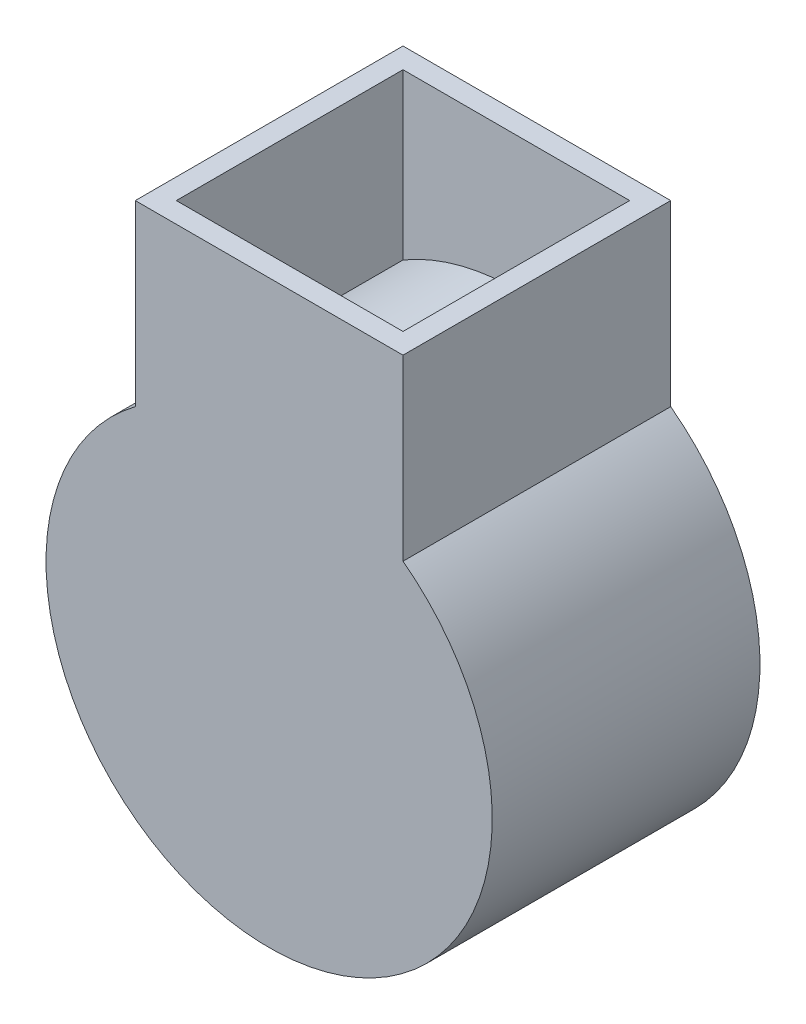
ISO-10303-21;
HEADER;
FILE_DESCRIPTION(('STEP AP214'),'2;1');
FILE_NAME('part.step','',(''),(''),'','','');
FILE_SCHEMA(('AUTOMOTIVE_DESIGN { 1 0 10303 214 1 1 1 1 }'));
ENDSEC;
DATA;
#1=APPLICATION_CONTEXT('core data for automotive mechanical design processes');
#2=APPLICATION_PROTOCOL_DEFINITION('international standard','automotive_design',2000,#1);
#3=PRODUCT_CONTEXT('',#1,'mechanical');
#4=PRODUCT('Part','Part','',(#3));
#5=PRODUCT_RELATED_PRODUCT_CATEGORY('part','',(#4));
#6=PRODUCT_DEFINITION_FORMATION('','',#4);
#7=PRODUCT_DEFINITION_CONTEXT('part definition',#1,'design');
#8=PRODUCT_DEFINITION('design','',#6,#7);
#9=PRODUCT_DEFINITION_SHAPE('','',#8);
#10=(LENGTH_UNIT() NAMED_UNIT(*) SI_UNIT(.MILLI.,.METRE.));
#11=(NAMED_UNIT(*) PLANE_ANGLE_UNIT() SI_UNIT($,.RADIAN.));
#12=(NAMED_UNIT(*) SI_UNIT($,.STERADIAN.) SOLID_ANGLE_UNIT());
#13=UNCERTAINTY_MEASURE_WITH_UNIT(LENGTH_MEASURE(1.E-05),#10,'distance_accuracy_value','');
#14=(GEOMETRIC_REPRESENTATION_CONTEXT(3) GLOBAL_UNCERTAINTY_ASSIGNED_CONTEXT((#13)) GLOBAL_UNIT_ASSIGNED_CONTEXT((#10,
#11,#12)) REPRESENTATION_CONTEXT('',''));
#15=CARTESIAN_POINT('',(0.,0.,0.));
#16=DIRECTION('',(0.,0.,1.));
#17=DIRECTION('',(1.,0.,0.));
#18=AXIS2_PLACEMENT_3D('',#15,#16,#17);
#19=CARTESIAN_POINT('',(0.,0.,30.));
#20=DIRECTION('',(0.,0.,-1.));
#21=DIRECTION('',(-1.,0.,0.));
#22=AXIS2_PLACEMENT_3D('',#19,#20,#21);
#23=CYLINDRICAL_SURFACE('',#22,50.);
#24=CARTESIAN_POINT('',(0.,0.,30.));
#25=DIRECTION('',(0.,0.,1.));
#26=DIRECTION('',(1.,0.,0.));
#27=AXIS2_PLACEMENT_3D('',#24,#25,#26);
#28=CIRCLE('',#27,50.);
#29=CARTESIAN_POINT('',(-30.,40.,30.));
#30=VERTEX_POINT('',#29);
#31=CARTESIAN_POINT('',(30.,40.,30.));
#32=VERTEX_POINT('',#31);
#33=EDGE_CURVE('E12',#30,#32,#28,.T.);
#34=ORIENTED_EDGE('',*,*,#33,.F.);
#35=DIRECTION('',(0.,0.,-1.));
#36=VECTOR('',#35,1.);
#37=CARTESIAN_POINT('',(-30.,40.,30.));
#38=LINE('',#37,#36);
#39=CARTESIAN_POINT('',(-30.,40.,-30.));
#40=VERTEX_POINT('',#39);
#41=EDGE_CURVE('E189',#40,#30,#38,.F.);
#42=ORIENTED_EDGE('',*,*,#41,.F.);
#43=CARTESIAN_POINT('',(0.,0.,-30.));
#44=DIRECTION('',(0.,0.,1.));
#45=DIRECTION('',(1.,0.,0.));
#46=AXIS2_PLACEMENT_3D('',#43,#44,#45);
#47=CIRCLE('',#46,50.);
#48=CARTESIAN_POINT('',(30.,40.,-30.));
#49=VERTEX_POINT('',#48);
#50=EDGE_CURVE('E62',#40,#49,#47,.T.);
#51=ORIENTED_EDGE('',*,*,#50,.T.);
#52=DIRECTION('',(0.,0.,-1.));
#53=VECTOR('',#52,1.);
#54=CARTESIAN_POINT('',(30.,40.,30.));
#55=LINE('',#54,#53);
#56=EDGE_CURVE('E125',#32,#49,#55,.T.);
#57=ORIENTED_EDGE('',*,*,#56,.F.);
#58=EDGE_LOOP('',(#34,#42,#51,#57));
#59=FACE_BOUND('',#58,.T.);
#60=ADVANCED_FACE('F59',(#59),#23,.T.);
#61=CARTESIAN_POINT('',(0.,0.,30.));
#62=DIRECTION('',(0.,0.,1.));
#63=DIRECTION('',(1.,0.,0.));
#64=AXIS2_PLACEMENT_3D('',#61,#62,#63);
#65=PLANE('',#64);
#66=ORIENTED_EDGE('',*,*,#33,.T.);
#67=DIRECTION('',(0.,1.,0.));
#68=VECTOR('',#67,1.);
#69=CARTESIAN_POINT('',(30.,-50.002,30.));
#70=LINE('',#69,#68);
#71=CARTESIAN_POINT('',(30.,80.,30.));
#72=VERTEX_POINT('',#71);
#73=EDGE_CURVE('E150',#32,#72,#70,.T.);
#74=ORIENTED_EDGE('',*,*,#73,.T.);
#75=DIRECTION('',(1.,0.,0.));
#76=VECTOR('',#75,1.);
#77=CARTESIAN_POINT('',(-30.,80.,30.));
#78=LINE('',#77,#76);
#79=CARTESIAN_POINT('',(-30.,80.,30.));
#80=VERTEX_POINT('',#79);
#81=EDGE_CURVE('E202',#80,#72,#78,.T.);
#82=ORIENTED_EDGE('',*,*,#81,.F.);
#83=DIRECTION('',(0.,1.,0.));
#84=VECTOR('',#83,1.);
#85=CARTESIAN_POINT('',(-30.,-50.002,30.));
#86=LINE('',#85,#84);
#87=EDGE_CURVE('E148',#30,#80,#86,.T.);
#88=ORIENTED_EDGE('',*,*,#87,.F.);
#89=EDGE_LOOP('',(#66,#74,#82,#88));
#90=FACE_BOUND('',#89,.T.);
#91=ADVANCED_FACE('F179',(#90),#65,.T.);
#92=CARTESIAN_POINT('',(0.,0.,-30.));
#93=DIRECTION('',(0.,0.,1.));
#94=DIRECTION('',(1.,0.,0.));
#95=AXIS2_PLACEMENT_3D('',#92,#93,#94);
#96=PLANE('',#95);
#97=CARTESIAN_POINT('',(0.,0.,-30.));
#98=DIRECTION('',(0.,0.,-1.));
#99=DIRECTION('',(-1.,0.,0.));
#100=AXIS2_PLACEMENT_3D('',#97,#98,#99);
#101=CIRCLE('',#100,45.);
#102=CARTESIAN_POINT('',(-45.,0.,-30.));
#103=VERTEX_POINT('',#102);
#104=EDGE_CURVE('E165',#103,#103,#101,.T.);
#105=ORIENTED_EDGE('',*,*,#104,.F.);
#106=EDGE_LOOP('',(#105));
#107=FACE_BOUND('',#106,.T.);
#108=ORIENTED_EDGE('',*,*,#50,.F.);
#109=DIRECTION('',(0.,1.,0.));
#110=VECTOR('',#109,1.);
#111=CARTESIAN_POINT('',(-30.,-50.002,-30.));
#112=LINE('',#111,#110);
#113=CARTESIAN_POINT('',(-30.,80.,-30.));
#114=VERTEX_POINT('',#113);
#115=EDGE_CURVE('E141',#40,#114,#112,.T.);
#116=ORIENTED_EDGE('',*,*,#115,.T.);
#117=DIRECTION('',(-1.,0.,0.));
#118=VECTOR('',#117,1.);
#119=CARTESIAN_POINT('',(-30.,80.,-30.));
#120=LINE('',#119,#118);
#121=CARTESIAN_POINT('',(30.,80.,-30.));
#122=VERTEX_POINT('',#121);
#123=EDGE_CURVE('E201',#122,#114,#120,.T.);
#124=ORIENTED_EDGE('',*,*,#123,.F.);
#125=DIRECTION('',(0.,1.,0.));
#126=VECTOR('',#125,1.);
#127=CARTESIAN_POINT('',(30.,-50.002,-30.));
#128=LINE('',#127,#126);
#129=EDGE_CURVE('E139',#49,#122,#128,.T.);
#130=ORIENTED_EDGE('',*,*,#129,.F.);
#131=EDGE_LOOP('',(#108,#116,#124,#130));
#132=FACE_BOUND('',#131,.T.);
#133=ADVANCED_FACE('F176',(#107,#132),#96,.F.);
#134=CARTESIAN_POINT('',(0.,0.,-28.));
#135=DIRECTION('',(0.,0.,-1.));
#136=DIRECTION('',(-1.,0.,0.));
#137=AXIS2_PLACEMENT_3D('',#134,#135,#136);
#138=CYLINDRICAL_SURFACE('',#137,45.);
#139=CARTESIAN_POINT('',(0.,0.,-28.));
#140=DIRECTION('',(0.,0.,-1.));
#141=DIRECTION('',(-1.,0.,0.));
#142=AXIS2_PLACEMENT_3D('',#139,#140,#141);
#143=CIRCLE('',#142,45.);
#144=CARTESIAN_POINT('',(-45.,0.,-28.));
#145=VERTEX_POINT('',#144);
#146=EDGE_CURVE('E168',#145,#145,#143,.T.);
#147=ORIENTED_EDGE('',*,*,#146,.F.);
#148=EDGE_LOOP('',(#147));
#149=FACE_BOUND('',#148,.T.);
#150=ORIENTED_EDGE('',*,*,#104,.T.);
#151=EDGE_LOOP('',(#150));
#152=FACE_BOUND('',#151,.T.);
#153=ADVANCED_FACE('F174',(#149,#152),#138,.F.);
#154=CARTESIAN_POINT('',(0.,0.,-28.));
#155=DIRECTION('',(0.,0.,-1.));
#156=DIRECTION('',(-1.,0.,0.));
#157=AXIS2_PLACEMENT_3D('',#154,#155,#156);
#158=PLANE('',#157);
#159=CARTESIAN_POINT('',(0.,0.,-28.));
#160=DIRECTION('',(0.,0.,-1.));
#161=DIRECTION('',(-1.,0.,0.));
#162=AXIS2_PLACEMENT_3D('',#159,#160,#161);
#163=CIRCLE('',#162,32.5);
#164=CARTESIAN_POINT('',(-32.5,0.,-28.));
#165=VERTEX_POINT('',#164);
#166=EDGE_CURVE('E162',#165,#165,#163,.T.);
#167=ORIENTED_EDGE('',*,*,#166,.F.);
#168=EDGE_LOOP('',(#167));
#169=FACE_BOUND('',#168,.T.);
#170=ORIENTED_EDGE('',*,*,#146,.T.);
#171=EDGE_LOOP('',(#170));
#172=FACE_BOUND('',#171,.T.);
#173=ADVANCED_FACE('F267',(#169,#172),#158,.T.);
#174=CARTESIAN_POINT('',(0.,0.,-28.));
#175=DIRECTION('',(0.,0.,-1.));
#176=DIRECTION('',(-1.,0.,0.));
#177=AXIS2_PLACEMENT_3D('',#174,#175,#176);
#178=CYLINDRICAL_SURFACE('',#177,32.5);
#179=ORIENTED_EDGE('',*,*,#166,.T.);
#180=EDGE_LOOP('',(#179));
#181=FACE_BOUND('',#180,.T.);
#182=CARTESIAN_POINT('',(0.,0.,-30.));
#183=DIRECTION('',(0.,0.,-1.));
#184=DIRECTION('',(-1.,0.,0.));
#185=AXIS2_PLACEMENT_3D('',#182,#183,#184);
#186=CIRCLE('',#185,32.5);
#187=CARTESIAN_POINT('',(-32.5,0.,-30.));
#188=VERTEX_POINT('',#187);
#189=EDGE_CURVE('E157',#188,#188,#186,.T.);
#190=ORIENTED_EDGE('',*,*,#189,.F.);
#191=EDGE_LOOP('',(#190));
#192=FACE_BOUND('',#191,.T.);
#193=ADVANCED_FACE('F264',(#181,#192),#178,.T.);
#194=CARTESIAN_POINT('',(0.,0.,-30.));
#195=DIRECTION('',(0.,0.,-1.));
#196=DIRECTION('',(-1.,0.,0.));
#197=AXIS2_PLACEMENT_3D('',#194,#195,#196);
#198=CIRCLE('',#197,13.);
#199=CARTESIAN_POINT('',(-13.,0.,-30.));
#200=VERTEX_POINT('',#199);
#201=EDGE_CURVE('E158',#200,#200,#198,.T.);
#202=ORIENTED_EDGE('',*,*,#201,.F.);
#203=EDGE_LOOP('',(#202));
#204=FACE_BOUND('',#203,.T.);
#205=ORIENTED_EDGE('',*,*,#189,.T.);
#206=EDGE_LOOP('',(#205));
#207=FACE_BOUND('',#206,.T.);
#208=ADVANCED_FACE('F180',(#204,#207),#96,.F.);
#209=CARTESIAN_POINT('',(0.,0.,-24.));
#210=DIRECTION('',(0.,0.,-1.));
#211=DIRECTION('',(-1.,0.,0.));
#212=AXIS2_PLACEMENT_3D('',#209,#210,#211);
#213=CYLINDRICAL_SURFACE('',#212,13.);
#214=CARTESIAN_POINT('',(0.,0.,-24.));
#215=DIRECTION('',(0.,0.,-1.));
#216=DIRECTION('',(-1.,0.,0.));
#217=AXIS2_PLACEMENT_3D('',#214,#215,#216);
#218=CIRCLE('',#217,13.);
#219=CARTESIAN_POINT('',(-13.,0.,-24.));
#220=VERTEX_POINT('',#219);
#221=EDGE_CURVE('E154',#220,#220,#218,.T.);
#222=ORIENTED_EDGE('',*,*,#221,.F.);
#223=EDGE_LOOP('',(#222));
#224=FACE_BOUND('',#223,.T.);
#225=ORIENTED_EDGE('',*,*,#201,.T.);
#226=EDGE_LOOP('',(#225));
#227=FACE_BOUND('',#226,.T.);
#228=ADVANCED_FACE('F259',(#224,#227),#213,.F.);
#229=CARTESIAN_POINT('',(0.,0.,-24.));
#230=DIRECTION('',(0.,0.,-1.));
#231=DIRECTION('',(-1.,0.,0.));
#232=AXIS2_PLACEMENT_3D('',#229,#230,#231);
#233=PLANE('',#232);
#234=ORIENTED_EDGE('',*,*,#221,.T.);
#235=EDGE_LOOP('',(#234));
#236=FACE_BOUND('',#235,.T.);
#237=ADVANCED_FACE('F256',(#236),#233,.T.);
#238=CARTESIAN_POINT('',(-25.4,-50.002,25.4));
#239=DIRECTION('',(0.,0.,1.));
#240=DIRECTION('',(1.,0.,0.));
#241=AXIS2_PLACEMENT_3D('',#238,#239,#240);
#242=PLANE('',#241);
#243=CARTESIAN_POINT('',(0.,0.,25.4));
#244=DIRECTION('',(0.,0.,1.));
#245=DIRECTION('',(1.,0.,0.));
#246=AXIS2_PLACEMENT_3D('',#243,#244,#245);
#247=CIRCLE('',#246,50.);
#248=CARTESIAN_POINT('',(-25.4,43.0678534408206,25.4));
#249=VERTEX_POINT('',#248);
#250=CARTESIAN_POINT('',(25.4,43.0678534408206,25.4));
#251=VERTEX_POINT('',#250);
#252=EDGE_CURVE('E77',#249,#251,#247,.F.);
#253=ORIENTED_EDGE('',*,*,#252,.F.);
#254=DIRECTION('',(0.,1.,0.));
#255=VECTOR('',#254,1.);
#256=CARTESIAN_POINT('',(-25.4,-50.002,25.4));
#257=LINE('',#256,#255);
#258=CARTESIAN_POINT('',(-25.4,80.,25.4));
#259=VERTEX_POINT('',#258);
#260=EDGE_CURVE('E143',#249,#259,#257,.T.);
#261=ORIENTED_EDGE('',*,*,#260,.T.);
#262=DIRECTION('',(1.,0.,0.));
#263=VECTOR('',#262,1.);
#264=CARTESIAN_POINT('',(-25.4,80.,25.4));
#265=LINE('',#264,#263);
#266=CARTESIAN_POINT('',(25.4,80.,25.4));
#267=VERTEX_POINT('',#266);
#268=EDGE_CURVE('E212',#259,#267,#265,.T.);
#269=ORIENTED_EDGE('',*,*,#268,.T.);
#270=DIRECTION('',(0.,1.,0.));
#271=VECTOR('',#270,1.);
#272=CARTESIAN_POINT('',(25.4,-50.002,25.4));
#273=LINE('',#272,#271);
#274=EDGE_CURVE('E192',#251,#267,#273,.T.);
#275=ORIENTED_EDGE('',*,*,#274,.F.);
#276=EDGE_LOOP('',(#253,#261,#269,#275));
#277=FACE_BOUND('',#276,.T.);
#278=ADVANCED_FACE('F223',(#277),#242,.F.);
#279=CARTESIAN_POINT('',(-30.,-50.002,30.));
#280=DIRECTION('',(-1.,0.,0.));
#281=DIRECTION('',(0.,0.,1.));
#282=AXIS2_PLACEMENT_3D('',#279,#280,#281);
#283=PLANE('',#282);
#284=ORIENTED_EDGE('',*,*,#115,.F.);
#285=ORIENTED_EDGE('',*,*,#41,.T.);
#286=ORIENTED_EDGE('',*,*,#87,.T.);
#287=DIRECTION('',(0.,0.,1.));
#288=VECTOR('',#287,1.);
#289=CARTESIAN_POINT('',(-30.,80.,30.));
#290=LINE('',#289,#288);
#291=EDGE_CURVE('E196',#114,#80,#290,.T.);
#292=ORIENTED_EDGE('',*,*,#291,.F.);
#293=EDGE_LOOP('',(#284,#285,#286,#292));
#294=FACE_BOUND('',#293,.T.);
#295=ADVANCED_FACE('F194',(#294),#283,.T.);
#296=CARTESIAN_POINT('',(-25.4,-50.002,25.4));
#297=DIRECTION('',(-1.,0.,0.));
#298=DIRECTION('',(0.,0.,1.));
#299=AXIS2_PLACEMENT_3D('',#296,#297,#298);
#300=PLANE('',#299);
#301=DIRECTION('',(0.,0.,-1.));
#302=VECTOR('',#301,1.);
#303=CARTESIAN_POINT('',(-25.4,43.0678534408206,30.));
#304=LINE('',#303,#302);
#305=CARTESIAN_POINT('',(-25.4,43.0678534408206,-25.4));
#306=VERTEX_POINT('',#305);
#307=EDGE_CURVE('E73',#306,#249,#304,.F.);
#308=ORIENTED_EDGE('',*,*,#307,.F.);
#309=DIRECTION('',(0.,1.,0.));
#310=VECTOR('',#309,1.);
#311=CARTESIAN_POINT('',(-25.4,-50.002,-25.4));
#312=LINE('',#311,#310);
#313=CARTESIAN_POINT('',(-25.4,80.,-25.4));
#314=VERTEX_POINT('',#313);
#315=EDGE_CURVE('E133',#306,#314,#312,.T.);
#316=ORIENTED_EDGE('',*,*,#315,.T.);
#317=DIRECTION('',(0.,0.,1.));
#318=VECTOR('',#317,1.);
#319=CARTESIAN_POINT('',(-25.4,80.,25.4));
#320=LINE('',#319,#318);
#321=EDGE_CURVE('E213',#314,#259,#320,.T.);
#322=ORIENTED_EDGE('',*,*,#321,.T.);
#323=ORIENTED_EDGE('',*,*,#260,.F.);
#324=EDGE_LOOP('',(#308,#316,#322,#323));
#325=FACE_BOUND('',#324,.T.);
#326=ADVANCED_FACE('F227',(#325),#300,.F.);
#327=CARTESIAN_POINT('',(0.,80.,0.));
#328=DIRECTION('',(0.,-1.,0.));
#329=DIRECTION('',(0.,0.,-1.));
#330=AXIS2_PLACEMENT_3D('',#327,#328,#329);
#331=PLANE('',#330);
#332=DIRECTION('',(0.,0.,-1.));
#333=VECTOR('',#332,1.);
#334=CARTESIAN_POINT('',(30.,80.,30.));
#335=LINE('',#334,#333);
#336=EDGE_CURVE('E161',#72,#122,#335,.T.);
#337=ORIENTED_EDGE('',*,*,#336,.T.);
#338=ORIENTED_EDGE('',*,*,#123,.T.);
#339=ORIENTED_EDGE('',*,*,#291,.T.);
#340=ORIENTED_EDGE('',*,*,#81,.T.);
#341=EDGE_LOOP('',(#337,#338,#339,#340));
#342=FACE_BOUND('',#341,.T.);
#343=DIRECTION('',(0.,0.,-1.));
#344=VECTOR('',#343,1.);
#345=CARTESIAN_POINT('',(25.4,80.,25.4));
#346=LINE('',#345,#344);
#347=CARTESIAN_POINT('',(25.4,80.,-25.4));
#348=VERTEX_POINT('',#347);
#349=EDGE_CURVE('E138',#267,#348,#346,.T.);
#350=ORIENTED_EDGE('',*,*,#349,.F.);
#351=ORIENTED_EDGE('',*,*,#268,.F.);
#352=ORIENTED_EDGE('',*,*,#321,.F.);
#353=DIRECTION('',(-1.,0.,0.));
#354=VECTOR('',#353,1.);
#355=CARTESIAN_POINT('',(-25.4,80.,-25.4));
#356=LINE('',#355,#354);
#357=EDGE_CURVE('E216',#348,#314,#356,.T.);
#358=ORIENTED_EDGE('',*,*,#357,.F.);
#359=EDGE_LOOP('',(#350,#351,#352,#358));
#360=FACE_BOUND('',#359,.T.);
#361=ADVANCED_FACE('F205',(#342,#360),#331,.F.);
#362=CARTESIAN_POINT('',(25.4,-50.002,25.4));
#363=DIRECTION('',(1.,0.,0.));
#364=DIRECTION('',(0.,0.,-1.));
#365=AXIS2_PLACEMENT_3D('',#362,#363,#364);
#366=PLANE('',#365);
#367=DIRECTION('',(0.,0.,-1.));
#368=VECTOR('',#367,1.);
#369=CARTESIAN_POINT('',(25.4,43.0678534408206,30.));
#370=LINE('',#369,#368);
#371=CARTESIAN_POINT('',(25.4,43.0678534408206,-25.4));
#372=VERTEX_POINT('',#371);
#373=EDGE_CURVE('E118',#251,#372,#370,.T.);
#374=ORIENTED_EDGE('',*,*,#373,.F.);
#375=ORIENTED_EDGE('',*,*,#274,.T.);
#376=ORIENTED_EDGE('',*,*,#349,.T.);
#377=DIRECTION('',(0.,1.,0.));
#378=VECTOR('',#377,1.);
#379=CARTESIAN_POINT('',(25.4,-50.002,-25.4));
#380=LINE('',#379,#378);
#381=EDGE_CURVE('E131',#372,#348,#380,.T.);
#382=ORIENTED_EDGE('',*,*,#381,.F.);
#383=EDGE_LOOP('',(#374,#375,#376,#382));
#384=FACE_BOUND('',#383,.T.);
#385=ADVANCED_FACE('F136',(#384),#366,.F.);
#386=CARTESIAN_POINT('',(-25.4,-50.002,-25.4));
#387=DIRECTION('',(0.,0.,-1.));
#388=DIRECTION('',(-1.,0.,0.));
#389=AXIS2_PLACEMENT_3D('',#386,#387,#388);
#390=PLANE('',#389);
#391=CARTESIAN_POINT('',(0.,0.,-25.4));
#392=DIRECTION('',(0.,0.,-1.));
#393=DIRECTION('',(-1.,0.,0.));
#394=AXIS2_PLACEMENT_3D('',#391,#392,#393);
#395=CIRCLE('',#394,50.);
#396=EDGE_CURVE('E121',#372,#306,#395,.F.);
#397=ORIENTED_EDGE('',*,*,#396,.F.);
#398=ORIENTED_EDGE('',*,*,#381,.T.);
#399=ORIENTED_EDGE('',*,*,#357,.T.);
#400=ORIENTED_EDGE('',*,*,#315,.F.);
#401=EDGE_LOOP('',(#397,#398,#399,#400));
#402=FACE_BOUND('',#401,.T.);
#403=ADVANCED_FACE('F129',(#402),#390,.F.);
#404=CARTESIAN_POINT('',(30.,-50.002,30.));
#405=DIRECTION('',(1.,0.,0.));
#406=DIRECTION('',(0.,0.,-1.));
#407=AXIS2_PLACEMENT_3D('',#404,#405,#406);
#408=PLANE('',#407);
#409=ORIENTED_EDGE('',*,*,#73,.F.);
#410=ORIENTED_EDGE('',*,*,#56,.T.);
#411=ORIENTED_EDGE('',*,*,#129,.T.);
#412=ORIENTED_EDGE('',*,*,#336,.F.);
#413=EDGE_LOOP('',(#409,#410,#411,#412));
#414=FACE_BOUND('',#413,.T.);
#415=ADVANCED_FACE('F244',(#414),#408,.T.);
#416=ORIENTED_EDGE('',*,*,#252,.T.);
#417=ORIENTED_EDGE('',*,*,#373,.T.);
#418=ORIENTED_EDGE('',*,*,#396,.T.);
#419=ORIENTED_EDGE('',*,*,#307,.T.);
#420=EDGE_LOOP('',(#416,#417,#418,#419));
#421=FACE_BOUND('',#420,.T.);
#422=ADVANCED_FACE('F120',(#421),#23,.T.);
#423=CLOSED_SHELL('',(#60,#91,#133,#153,#173,#193,#208,#228,#237,#278,#295,#326,#361,#385,#403,
#415,#422));
#424=MANIFOLD_SOLID_BREP('B2',#423);
#425=ADVANCED_BREP_SHAPE_REPRESENTATION('',(#18,#424),#14);
#426=SHAPE_DEFINITION_REPRESENTATION(#9,#425);
ENDSEC;
END-ISO-10303-21;
